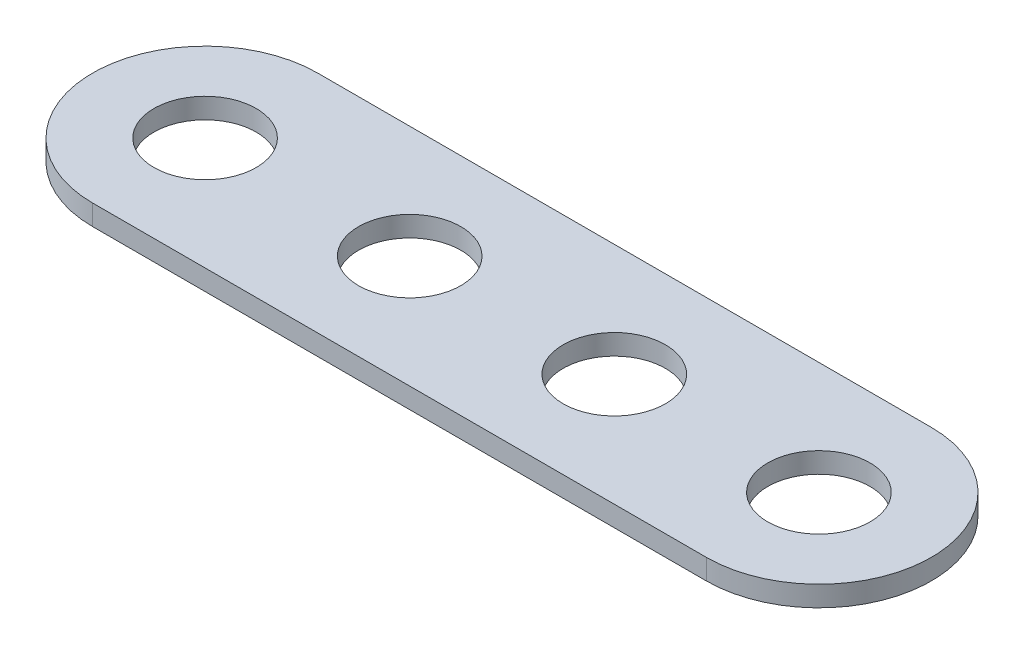
ISO-10303-21;
HEADER;
FILE_DESCRIPTION(('STEP AP214'),'2;1');
FILE_NAME('part.step','',(''),(''),'','','');
FILE_SCHEMA(('AUTOMOTIVE_DESIGN { 1 0 10303 214 1 1 1 1 }'));
ENDSEC;
DATA;
#1=APPLICATION_CONTEXT('core data for automotive mechanical design processes');
#2=APPLICATION_PROTOCOL_DEFINITION('international standard','automotive_design',2000,#1);
#3=PRODUCT_CONTEXT('',#1,'mechanical');
#4=PRODUCT('Part','Part','',(#3));
#5=PRODUCT_RELATED_PRODUCT_CATEGORY('part','',(#4));
#6=PRODUCT_DEFINITION_FORMATION('','',#4);
#7=PRODUCT_DEFINITION_CONTEXT('part definition',#1,'design');
#8=PRODUCT_DEFINITION('design','',#6,#7);
#9=PRODUCT_DEFINITION_SHAPE('','',#8);
#10=(LENGTH_UNIT() NAMED_UNIT(*) SI_UNIT(.MILLI.,.METRE.));
#11=(NAMED_UNIT(*) PLANE_ANGLE_UNIT() SI_UNIT($,.RADIAN.));
#12=(NAMED_UNIT(*) SI_UNIT($,.STERADIAN.) SOLID_ANGLE_UNIT());
#13=UNCERTAINTY_MEASURE_WITH_UNIT(LENGTH_MEASURE(1.E-05),#10,'distance_accuracy_value','');
#14=(GEOMETRIC_REPRESENTATION_CONTEXT(3) GLOBAL_UNCERTAINTY_ASSIGNED_CONTEXT((#13)) GLOBAL_UNIT_ASSIGNED_CONTEXT((#10,
#11,#12)) REPRESENTATION_CONTEXT('',''));
#15=CARTESIAN_POINT('',(0.,0.,0.));
#16=DIRECTION('',(0.,0.,1.));
#17=DIRECTION('',(1.,0.,0.));
#18=AXIS2_PLACEMENT_3D('',#15,#16,#17);
#19=CARTESIAN_POINT('',(0.,1.,0.));
#20=DIRECTION('',(0.,1.,0.));
#21=DIRECTION('',(0.,0.,1.));
#22=AXIS2_PLACEMENT_3D('',#19,#20,#21);
#23=PLANE('',#22);
#24=CARTESIAN_POINT('',(-10.,1.,0.));
#25=DIRECTION('',(0.,1.,0.));
#26=DIRECTION('',(0.,0.,1.));
#27=AXIS2_PLACEMENT_3D('',#24,#25,#26);
#28=CIRCLE('',#27,2.5);
#29=CARTESIAN_POINT('',(-10.,1.,2.5));
#30=VERTEX_POINT('',#29);
#31=EDGE_CURVE('E123',#30,#30,#28,.T.);
#32=ORIENTED_EDGE('',*,*,#31,.F.);
#33=EDGE_LOOP('',(#32));
#34=FACE_BOUND('',#33,.T.);
#35=CARTESIAN_POINT('',(0.,1.,0.));
#36=DIRECTION('',(0.,1.,0.));
#37=DIRECTION('',(0.,0.,1.));
#38=AXIS2_PLACEMENT_3D('',#35,#36,#37);
#39=CIRCLE('',#38,2.5);
#40=CARTESIAN_POINT('',(0.,1.,2.5));
#41=VERTEX_POINT('',#40);
#42=EDGE_CURVE('E102',#41,#41,#39,.T.);
#43=ORIENTED_EDGE('',*,*,#42,.F.);
#44=EDGE_LOOP('',(#43));
#45=FACE_BOUND('',#44,.T.);
#46=CARTESIAN_POINT('',(0.,1.,0.));
#47=DIRECTION('',(0.,1.,0.));
#48=DIRECTION('',(0.,0.,1.));
#49=AXIS2_PLACEMENT_3D('',#46,#47,#48);
#50=CIRCLE('',#49,5.5);
#51=CARTESIAN_POINT('',(0.,1.,5.5));
#52=VERTEX_POINT('',#51);
#53=CARTESIAN_POINT('',(0.,1.,-5.5));
#54=VERTEX_POINT('',#53);
#55=EDGE_CURVE('E87',#52,#54,#50,.T.);
#56=ORIENTED_EDGE('',*,*,#55,.T.);
#57=DIRECTION('',(-1.,0.,0.));
#58=VECTOR('',#57,1.);
#59=CARTESIAN_POINT('',(0.,1.,-5.5));
#60=LINE('',#59,#58);
#61=CARTESIAN_POINT('',(-30.,1.,-5.5));
#62=VERTEX_POINT('',#61);
#63=EDGE_CURVE('E82',#54,#62,#60,.T.);
#64=ORIENTED_EDGE('',*,*,#63,.T.);
#65=CARTESIAN_POINT('',(-30.,1.,0.));
#66=DIRECTION('',(0.,1.,0.));
#67=DIRECTION('',(0.,0.,1.));
#68=AXIS2_PLACEMENT_3D('',#65,#66,#67);
#69=CIRCLE('',#68,5.5);
#70=CARTESIAN_POINT('',(-30.,1.,5.5));
#71=VERTEX_POINT('',#70);
#72=EDGE_CURVE('E85',#62,#71,#69,.T.);
#73=ORIENTED_EDGE('',*,*,#72,.T.);
#74=DIRECTION('',(1.,0.,0.));
#75=VECTOR('',#74,1.);
#76=CARTESIAN_POINT('',(0.,1.,5.5));
#77=LINE('',#76,#75);
#78=EDGE_CURVE('E52',#71,#52,#77,.T.);
#79=ORIENTED_EDGE('',*,*,#78,.T.);
#80=EDGE_LOOP('',(#56,#64,#73,#79));
#81=FACE_BOUND('',#80,.T.);
#82=CARTESIAN_POINT('',(-20.,1.,0.));
#83=DIRECTION('',(0.,1.,0.));
#84=DIRECTION('',(0.,0.,1.));
#85=AXIS2_PLACEMENT_3D('',#82,#83,#84);
#86=CIRCLE('',#85,2.5);
#87=CARTESIAN_POINT('',(-20.,1.,2.5));
#88=VERTEX_POINT('',#87);
#89=EDGE_CURVE('E117',#88,#88,#86,.T.);
#90=ORIENTED_EDGE('',*,*,#89,.F.);
#91=EDGE_LOOP('',(#90));
#92=FACE_BOUND('',#91,.T.);
#93=CARTESIAN_POINT('',(-30.,1.,0.));
#94=DIRECTION('',(0.,1.,0.));
#95=DIRECTION('',(0.,0.,1.));
#96=AXIS2_PLACEMENT_3D('',#93,#94,#95);
#97=CIRCLE('',#96,2.5);
#98=CARTESIAN_POINT('',(-30.,1.,2.5));
#99=VERTEX_POINT('',#98);
#100=EDGE_CURVE('E129',#99,#99,#97,.T.);
#101=ORIENTED_EDGE('',*,*,#100,.F.);
#102=EDGE_LOOP('',(#101));
#103=FACE_BOUND('',#102,.T.);
#104=ADVANCED_FACE('F35',(#34,#45,#81,#92,#103),#23,.T.);
#105=CARTESIAN_POINT('',(0.,0.,0.));
#106=DIRECTION('',(0.,1.,0.));
#107=DIRECTION('',(0.,0.,1.));
#108=AXIS2_PLACEMENT_3D('',#105,#106,#107);
#109=PLANE('',#108);
#110=CARTESIAN_POINT('',(-10.,0.,0.));
#111=DIRECTION('',(0.,1.,0.));
#112=DIRECTION('',(0.,0.,1.));
#113=AXIS2_PLACEMENT_3D('',#110,#111,#112);
#114=CIRCLE('',#113,2.5);
#115=CARTESIAN_POINT('',(-10.,0.,2.5));
#116=VERTEX_POINT('',#115);
#117=EDGE_CURVE('E126',#116,#116,#114,.T.);
#118=ORIENTED_EDGE('',*,*,#117,.T.);
#119=EDGE_LOOP('',(#118));
#120=FACE_BOUND('',#119,.T.);
#121=CARTESIAN_POINT('',(0.,0.,0.));
#122=DIRECTION('',(0.,1.,0.));
#123=DIRECTION('',(0.,0.,1.));
#124=AXIS2_PLACEMENT_3D('',#121,#122,#123);
#125=CIRCLE('',#124,2.5);
#126=CARTESIAN_POINT('',(0.,0.,2.5));
#127=VERTEX_POINT('',#126);
#128=EDGE_CURVE('E114',#127,#127,#125,.T.);
#129=ORIENTED_EDGE('',*,*,#128,.T.);
#130=EDGE_LOOP('',(#129));
#131=FACE_BOUND('',#130,.T.);
#132=CARTESIAN_POINT('',(0.,0.,0.));
#133=DIRECTION('',(0.,1.,0.));
#134=DIRECTION('',(0.,0.,1.));
#135=AXIS2_PLACEMENT_3D('',#132,#133,#134);
#136=CIRCLE('',#135,5.5);
#137=CARTESIAN_POINT('',(0.,0.,5.5));
#138=VERTEX_POINT('',#137);
#139=CARTESIAN_POINT('',(0.,0.,-5.5));
#140=VERTEX_POINT('',#139);
#141=EDGE_CURVE('E99',#138,#140,#136,.T.);
#142=ORIENTED_EDGE('',*,*,#141,.F.);
#143=DIRECTION('',(1.,0.,0.));
#144=VECTOR('',#143,1.);
#145=CARTESIAN_POINT('',(0.,0.,5.5));
#146=LINE('',#145,#144);
#147=CARTESIAN_POINT('',(-30.,0.,5.5));
#148=VERTEX_POINT('',#147);
#149=EDGE_CURVE('E75',#148,#138,#146,.T.);
#150=ORIENTED_EDGE('',*,*,#149,.F.);
#151=CARTESIAN_POINT('',(-30.,0.,0.));
#152=DIRECTION('',(0.,1.,0.));
#153=DIRECTION('',(0.,0.,1.));
#154=AXIS2_PLACEMENT_3D('',#151,#152,#153);
#155=CIRCLE('',#154,5.5);
#156=CARTESIAN_POINT('',(-30.,0.,-5.5));
#157=VERTEX_POINT('',#156);
#158=EDGE_CURVE('E69',#157,#148,#155,.T.);
#159=ORIENTED_EDGE('',*,*,#158,.F.);
#160=DIRECTION('',(-1.,0.,0.));
#161=VECTOR('',#160,1.);
#162=CARTESIAN_POINT('',(0.,0.,-5.5));
#163=LINE('',#162,#161);
#164=EDGE_CURVE('E91',#140,#157,#163,.T.);
#165=ORIENTED_EDGE('',*,*,#164,.F.);
#166=EDGE_LOOP('',(#142,#150,#159,#165));
#167=FACE_BOUND('',#166,.T.);
#168=CARTESIAN_POINT('',(-20.,0.,0.));
#169=DIRECTION('',(0.,1.,0.));
#170=DIRECTION('',(0.,0.,1.));
#171=AXIS2_PLACEMENT_3D('',#168,#169,#170);
#172=CIRCLE('',#171,2.5);
#173=CARTESIAN_POINT('',(-20.,0.,2.5));
#174=VERTEX_POINT('',#173);
#175=EDGE_CURVE('E120',#174,#174,#172,.T.);
#176=ORIENTED_EDGE('',*,*,#175,.T.);
#177=EDGE_LOOP('',(#176));
#178=FACE_BOUND('',#177,.T.);
#179=CARTESIAN_POINT('',(-30.,0.,0.));
#180=DIRECTION('',(0.,1.,0.));
#181=DIRECTION('',(0.,0.,1.));
#182=AXIS2_PLACEMENT_3D('',#179,#180,#181);
#183=CIRCLE('',#182,2.5);
#184=CARTESIAN_POINT('',(-30.,0.,2.5));
#185=VERTEX_POINT('',#184);
#186=EDGE_CURVE('E132',#185,#185,#183,.T.);
#187=ORIENTED_EDGE('',*,*,#186,.T.);
#188=EDGE_LOOP('',(#187));
#189=FACE_BOUND('',#188,.T.);
#190=ADVANCED_FACE('F110',(#120,#131,#167,#178,#189),#109,.F.);
#191=CARTESIAN_POINT('',(0.,1.,0.));
#192=DIRECTION('',(0.,-1.,0.));
#193=DIRECTION('',(0.,0.,-1.));
#194=AXIS2_PLACEMENT_3D('',#191,#192,#193);
#195=CYLINDRICAL_SURFACE('',#194,5.5);
#196=ORIENTED_EDGE('',*,*,#141,.T.);
#197=DIRECTION('',(0.,-1.,0.));
#198=VECTOR('',#197,1.);
#199=CARTESIAN_POINT('',(0.,1.,-5.5));
#200=LINE('',#199,#198);
#201=EDGE_CURVE('E11',#54,#140,#200,.T.);
#202=ORIENTED_EDGE('',*,*,#201,.F.);
#203=ORIENTED_EDGE('',*,*,#55,.F.);
#204=DIRECTION('',(0.,-1.,0.));
#205=VECTOR('',#204,1.);
#206=CARTESIAN_POINT('',(0.,1.,5.5));
#207=LINE('',#206,#205);
#208=EDGE_CURVE('E95',#52,#138,#207,.T.);
#209=ORIENTED_EDGE('',*,*,#208,.T.);
#210=EDGE_LOOP('',(#196,#202,#203,#209));
#211=FACE_BOUND('',#210,.T.);
#212=ADVANCED_FACE('F37',(#211),#195,.T.);
#213=CARTESIAN_POINT('',(0.,1.,-5.5));
#214=DIRECTION('',(0.,0.,1.));
#215=DIRECTION('',(1.,0.,0.));
#216=AXIS2_PLACEMENT_3D('',#213,#214,#215);
#217=PLANE('',#216);
#218=ORIENTED_EDGE('',*,*,#164,.T.);
#219=DIRECTION('',(0.,-1.,0.));
#220=VECTOR('',#219,1.);
#221=CARTESIAN_POINT('',(-30.,1.,-5.5));
#222=LINE('',#221,#220);
#223=EDGE_CURVE('E44',#62,#157,#222,.T.);
#224=ORIENTED_EDGE('',*,*,#223,.F.);
#225=ORIENTED_EDGE('',*,*,#63,.F.);
#226=ORIENTED_EDGE('',*,*,#201,.T.);
#227=EDGE_LOOP('',(#218,#224,#225,#226));
#228=FACE_BOUND('',#227,.T.);
#229=ADVANCED_FACE('F90',(#228),#217,.F.);
#230=CARTESIAN_POINT('',(-30.,1.,0.));
#231=DIRECTION('',(0.,-1.,0.));
#232=DIRECTION('',(0.,0.,-1.));
#233=AXIS2_PLACEMENT_3D('',#230,#231,#232);
#234=CYLINDRICAL_SURFACE('',#233,5.5);
#235=ORIENTED_EDGE('',*,*,#158,.T.);
#236=DIRECTION('',(0.,-1.,0.));
#237=VECTOR('',#236,1.);
#238=CARTESIAN_POINT('',(-30.,1.,5.5));
#239=LINE('',#238,#237);
#240=EDGE_CURVE('E92',#71,#148,#239,.T.);
#241=ORIENTED_EDGE('',*,*,#240,.F.);
#242=ORIENTED_EDGE('',*,*,#72,.F.);
#243=ORIENTED_EDGE('',*,*,#223,.T.);
#244=EDGE_LOOP('',(#235,#241,#242,#243));
#245=FACE_BOUND('',#244,.T.);
#246=ADVANCED_FACE('F93',(#245),#234,.T.);
#247=CARTESIAN_POINT('',(0.,1.,5.5));
#248=DIRECTION('',(0.,0.,-1.));
#249=DIRECTION('',(-1.,0.,0.));
#250=AXIS2_PLACEMENT_3D('',#247,#248,#249);
#251=PLANE('',#250);
#252=ORIENTED_EDGE('',*,*,#149,.T.);
#253=ORIENTED_EDGE('',*,*,#208,.F.);
#254=ORIENTED_EDGE('',*,*,#78,.F.);
#255=ORIENTED_EDGE('',*,*,#240,.T.);
#256=EDGE_LOOP('',(#252,#253,#254,#255));
#257=FACE_BOUND('',#256,.T.);
#258=ADVANCED_FACE('F107',(#257),#251,.F.);
#259=CARTESIAN_POINT('',(0.,1.,0.));
#260=DIRECTION('',(0.,-1.,0.));
#261=DIRECTION('',(0.,0.,-1.));
#262=AXIS2_PLACEMENT_3D('',#259,#260,#261);
#263=CYLINDRICAL_SURFACE('',#262,2.5);
#264=ORIENTED_EDGE('',*,*,#42,.T.);
#265=EDGE_LOOP('',(#264));
#266=FACE_BOUND('',#265,.T.);
#267=ORIENTED_EDGE('',*,*,#128,.F.);
#268=EDGE_LOOP('',(#267));
#269=FACE_BOUND('',#268,.T.);
#270=ADVANCED_FACE('F152',(#266,#269),#263,.F.);
#271=CARTESIAN_POINT('',(-20.,1.,0.));
#272=DIRECTION('',(0.,-1.,0.));
#273=DIRECTION('',(0.,0.,-1.));
#274=AXIS2_PLACEMENT_3D('',#271,#272,#273);
#275=CYLINDRICAL_SURFACE('',#274,2.5);
#276=ORIENTED_EDGE('',*,*,#89,.T.);
#277=EDGE_LOOP('',(#276));
#278=FACE_BOUND('',#277,.T.);
#279=ORIENTED_EDGE('',*,*,#175,.F.);
#280=EDGE_LOOP('',(#279));
#281=FACE_BOUND('',#280,.T.);
#282=ADVANCED_FACE('F198',(#278,#281),#275,.F.);
#283=CARTESIAN_POINT('',(-10.,1.,0.));
#284=DIRECTION('',(0.,-1.,0.));
#285=DIRECTION('',(0.,0.,-1.));
#286=AXIS2_PLACEMENT_3D('',#283,#284,#285);
#287=CYLINDRICAL_SURFACE('',#286,2.5);
#288=ORIENTED_EDGE('',*,*,#31,.T.);
#289=EDGE_LOOP('',(#288));
#290=FACE_BOUND('',#289,.T.);
#291=ORIENTED_EDGE('',*,*,#117,.F.);
#292=EDGE_LOOP('',(#291));
#293=FACE_BOUND('',#292,.T.);
#294=ADVANCED_FACE('F206',(#290,#293),#287,.F.);
#295=CARTESIAN_POINT('',(-30.,1.,0.));
#296=DIRECTION('',(0.,-1.,0.));
#297=DIRECTION('',(0.,0.,-1.));
#298=AXIS2_PLACEMENT_3D('',#295,#296,#297);
#299=CYLINDRICAL_SURFACE('',#298,2.5);
#300=ORIENTED_EDGE('',*,*,#100,.T.);
#301=EDGE_LOOP('',(#300));
#302=FACE_BOUND('',#301,.T.);
#303=ORIENTED_EDGE('',*,*,#186,.F.);
#304=EDGE_LOOP('',(#303));
#305=FACE_BOUND('',#304,.T.);
#306=ADVANCED_FACE('F138',(#302,#305),#299,.F.);
#307=CLOSED_SHELL('',(#104,#190,#212,#229,#246,#258,#270,#282,#294,#306));
#308=MANIFOLD_SOLID_BREP('B2',#307);
#309=ADVANCED_BREP_SHAPE_REPRESENTATION('',(#18,#308),#14);
#310=SHAPE_DEFINITION_REPRESENTATION(#9,#309);
ENDSEC;
END-ISO-10303-21;
